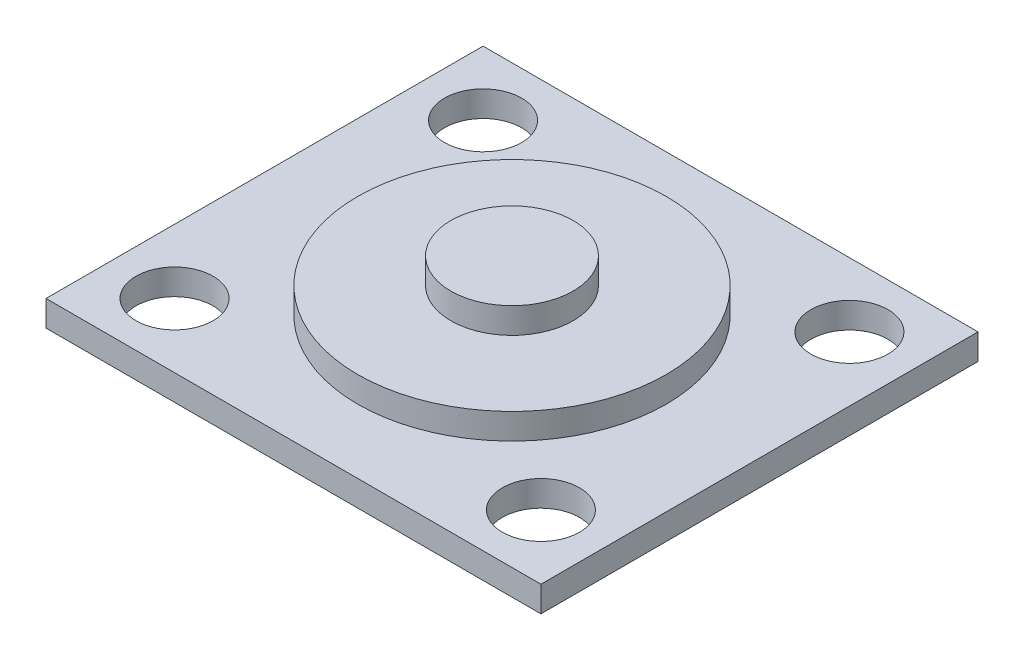
ISO-10303-21;
HEADER;
FILE_DESCRIPTION(('STEP AP214'),'2;1');
FILE_NAME('part.step','',(''),(''),'','','');
FILE_SCHEMA(('AUTOMOTIVE_DESIGN { 1 0 10303 214 1 1 1 1 }'));
ENDSEC;
DATA;
#1=APPLICATION_CONTEXT('core data for automotive mechanical design processes');
#2=APPLICATION_PROTOCOL_DEFINITION('international standard','automotive_design',2000,#1);
#3=PRODUCT_CONTEXT('',#1,'mechanical');
#4=PRODUCT('Part','Part','',(#3));
#5=PRODUCT_RELATED_PRODUCT_CATEGORY('part','',(#4));
#6=PRODUCT_DEFINITION_FORMATION('','',#4);
#7=PRODUCT_DEFINITION_CONTEXT('part definition',#1,'design');
#8=PRODUCT_DEFINITION('design','',#6,#7);
#9=PRODUCT_DEFINITION_SHAPE('','',#8);
#10=(LENGTH_UNIT() NAMED_UNIT(*) SI_UNIT(.MILLI.,.METRE.));
#11=(NAMED_UNIT(*) PLANE_ANGLE_UNIT() SI_UNIT($,.RADIAN.));
#12=(NAMED_UNIT(*) SI_UNIT($,.STERADIAN.) SOLID_ANGLE_UNIT());
#13=UNCERTAINTY_MEASURE_WITH_UNIT(LENGTH_MEASURE(1.E-05),#10,'distance_accuracy_value','');
#14=(GEOMETRIC_REPRESENTATION_CONTEXT(3) GLOBAL_UNCERTAINTY_ASSIGNED_CONTEXT((#13)) GLOBAL_UNIT_ASSIGNED_CONTEXT((#10,
#11,#12)) REPRESENTATION_CONTEXT('',''));
#15=CARTESIAN_POINT('',(0.,0.,0.));
#16=DIRECTION('',(0.,0.,1.));
#17=DIRECTION('',(1.,0.,0.));
#18=AXIS2_PLACEMENT_3D('',#15,#16,#17);
#19=CARTESIAN_POINT('',(-29.2998826313516,2.,0.));
#20=DIRECTION('',(1.,0.,0.));
#21=DIRECTION('',(0.,0.,-1.));
#22=AXIS2_PLACEMENT_3D('',#19,#20,#21);
#23=PLANE('',#22);
#24=DIRECTION('',(0.,0.,1.));
#25=VECTOR('',#24,1.);
#26=CARTESIAN_POINT('',(-29.2998826313516,0.,0.));
#27=LINE('',#26,#25);
#28=CARTESIAN_POINT('',(-29.2998826313516,0.,8.6384051626913));
#29=VERTEX_POINT('',#28);
#30=CARTESIAN_POINT('',(-29.2998826313516,0.,42.6384051626913));
#31=VERTEX_POINT('',#30);
#32=EDGE_CURVE('E114',#29,#31,#27,.T.);
#33=ORIENTED_EDGE('',*,*,#32,.T.);
#34=DIRECTION('',(0.,-1.,0.));
#35=VECTOR('',#34,1.);
#36=CARTESIAN_POINT('',(-29.2998826313516,2.,42.6384051626913));
#37=LINE('',#36,#35);
#38=CARTESIAN_POINT('',(-29.2998826313516,2.,42.6384051626913));
#39=VERTEX_POINT('',#38);
#40=EDGE_CURVE('E11',#39,#31,#37,.T.);
#41=ORIENTED_EDGE('',*,*,#40,.F.);
#42=DIRECTION('',(0.,0.,1.));
#43=VECTOR('',#42,1.);
#44=CARTESIAN_POINT('',(-29.2998826313516,2.,0.));
#45=LINE('',#44,#43);
#46=CARTESIAN_POINT('',(-29.2998826313516,2.,8.6384051626913));
#47=VERTEX_POINT('',#46);
#48=EDGE_CURVE('E86',#47,#39,#45,.T.);
#49=ORIENTED_EDGE('',*,*,#48,.F.);
#50=DIRECTION('',(0.,-1.,0.));
#51=VECTOR('',#50,1.);
#52=CARTESIAN_POINT('',(-29.2998826313516,2.,8.6384051626913));
#53=LINE('',#52,#51);
#54=EDGE_CURVE('E53',#47,#29,#53,.T.);
#55=ORIENTED_EDGE('',*,*,#54,.T.);
#56=EDGE_LOOP('',(#33,#41,#49,#55));
#57=FACE_BOUND('',#56,.T.);
#58=ADVANCED_FACE('F35',(#57),#23,.F.);
#59=CARTESIAN_POINT('',(0.,2.,42.6384051626913));
#60=DIRECTION('',(0.,0.,-1.));
#61=DIRECTION('',(-1.,0.,0.));
#62=AXIS2_PLACEMENT_3D('',#59,#60,#61);
#63=PLANE('',#62);
#64=DIRECTION('',(1.,0.,0.));
#65=VECTOR('',#64,1.);
#66=CARTESIAN_POINT('',(0.,0.,42.6384051626913));
#67=LINE('',#66,#65);
#68=CARTESIAN_POINT('',(9.20011736864843,0.,42.6384051626913));
#69=VERTEX_POINT('',#68);
#70=EDGE_CURVE('E91',#31,#69,#67,.T.);
#71=ORIENTED_EDGE('',*,*,#70,.T.);
#72=DIRECTION('',(0.,-1.,0.));
#73=VECTOR('',#72,1.);
#74=CARTESIAN_POINT('',(9.20011736864843,2.,42.6384051626913));
#75=LINE('',#74,#73);
#76=CARTESIAN_POINT('',(9.20011736864843,2.,42.6384051626913));
#77=VERTEX_POINT('',#76);
#78=EDGE_CURVE('E45',#77,#69,#75,.T.);
#79=ORIENTED_EDGE('',*,*,#78,.F.);
#80=DIRECTION('',(1.,0.,0.));
#81=VECTOR('',#80,1.);
#82=CARTESIAN_POINT('',(0.,2.,42.6384051626913));
#83=LINE('',#82,#81);
#84=EDGE_CURVE('E79',#39,#77,#83,.T.);
#85=ORIENTED_EDGE('',*,*,#84,.F.);
#86=ORIENTED_EDGE('',*,*,#40,.T.);
#87=EDGE_LOOP('',(#71,#79,#85,#86));
#88=FACE_BOUND('',#87,.T.);
#89=ADVANCED_FACE('F90',(#88),#63,.F.);
#90=CARTESIAN_POINT('',(9.20011736864842,2.,0.));
#91=DIRECTION('',(-1.,0.,0.));
#92=DIRECTION('',(0.,0.,1.));
#93=AXIS2_PLACEMENT_3D('',#90,#91,#92);
#94=PLANE('',#93);
#95=DIRECTION('',(0.,0.,-1.));
#96=VECTOR('',#95,1.);
#97=CARTESIAN_POINT('',(9.20011736864842,0.,0.));
#98=LINE('',#97,#96);
#99=CARTESIAN_POINT('',(9.20011736864842,0.,8.6384051626913));
#100=VERTEX_POINT('',#99);
#101=EDGE_CURVE('E117',#69,#100,#98,.T.);
#102=ORIENTED_EDGE('',*,*,#101,.T.);
#103=DIRECTION('',(0.,-1.,0.));
#104=VECTOR('',#103,1.);
#105=CARTESIAN_POINT('',(9.20011736864842,2.,8.6384051626913));
#106=LINE('',#105,#104);
#107=CARTESIAN_POINT('',(9.20011736864842,2.,8.6384051626913));
#108=VERTEX_POINT('',#107);
#109=EDGE_CURVE('E68',#108,#100,#106,.T.);
#110=ORIENTED_EDGE('',*,*,#109,.F.);
#111=DIRECTION('',(0.,0.,-1.));
#112=VECTOR('',#111,1.);
#113=CARTESIAN_POINT('',(9.20011736864842,2.,0.));
#114=LINE('',#113,#112);
#115=EDGE_CURVE('E85',#77,#108,#114,.T.);
#116=ORIENTED_EDGE('',*,*,#115,.F.);
#117=ORIENTED_EDGE('',*,*,#78,.T.);
#118=EDGE_LOOP('',(#102,#110,#116,#117));
#119=FACE_BOUND('',#118,.T.);
#120=ADVANCED_FACE('F95',(#119),#94,.F.);
#121=CARTESIAN_POINT('',(-24.2998826313516,2.,37.6384051626913));
#122=DIRECTION('',(0.,-1.,0.));
#123=DIRECTION('',(0.,0.,-1.));
#124=AXIS2_PLACEMENT_3D('',#121,#122,#123);
#125=CYLINDRICAL_SURFACE('',#124,3.);
#126=CARTESIAN_POINT('',(-24.2998826313516,2.,37.6384051626913));
#127=DIRECTION('',(0.,1.,0.));
#128=DIRECTION('',(0.,0.,1.));
#129=AXIS2_PLACEMENT_3D('',#126,#127,#128);
#130=CIRCLE('',#129,3.);
#131=CARTESIAN_POINT('',(-24.2998826313516,2.,40.6384051626913));
#132=VERTEX_POINT('',#131);
#133=EDGE_CURVE('E138',#132,#132,#130,.T.);
#134=ORIENTED_EDGE('',*,*,#133,.T.);
#135=EDGE_LOOP('',(#134));
#136=FACE_BOUND('',#135,.T.);
#137=CARTESIAN_POINT('',(-24.2998826313516,0.,37.6384051626913));
#138=DIRECTION('',(0.,1.,0.));
#139=DIRECTION('',(0.,0.,1.));
#140=AXIS2_PLACEMENT_3D('',#137,#138,#139);
#141=CIRCLE('',#140,3.);
#142=CARTESIAN_POINT('',(-24.2998826313516,0.,40.6384051626913));
#143=VERTEX_POINT('',#142);
#144=EDGE_CURVE('E111',#143,#143,#141,.T.);
#145=ORIENTED_EDGE('',*,*,#144,.F.);
#146=EDGE_LOOP('',(#145));
#147=FACE_BOUND('',#146,.T.);
#148=ADVANCED_FACE('F142',(#136,#147),#125,.F.);
#149=CARTESIAN_POINT('',(4.20011736864842,2.,37.6384051626913));
#150=DIRECTION('',(0.,-1.,0.));
#151=DIRECTION('',(0.,0.,-1.));
#152=AXIS2_PLACEMENT_3D('',#149,#150,#151);
#153=CYLINDRICAL_SURFACE('',#152,3.);
#154=CARTESIAN_POINT('',(4.20011736864842,2.,37.6384051626913));
#155=DIRECTION('',(0.,1.,0.));
#156=DIRECTION('',(0.,0.,1.));
#157=AXIS2_PLACEMENT_3D('',#154,#155,#156);
#158=CIRCLE('',#157,3.);
#159=CARTESIAN_POINT('',(4.20011736864842,2.,40.6384051626913));
#160=VERTEX_POINT('',#159);
#161=EDGE_CURVE('E131',#160,#160,#158,.T.);
#162=ORIENTED_EDGE('',*,*,#161,.T.);
#163=EDGE_LOOP('',(#162));
#164=FACE_BOUND('',#163,.T.);
#165=CARTESIAN_POINT('',(4.20011736864842,0.,37.6384051626913));
#166=DIRECTION('',(0.,1.,0.));
#167=DIRECTION('',(0.,0.,1.));
#168=AXIS2_PLACEMENT_3D('',#165,#166,#167);
#169=CIRCLE('',#168,3.);
#170=CARTESIAN_POINT('',(4.20011736864842,0.,40.6384051626913));
#171=VERTEX_POINT('',#170);
#172=EDGE_CURVE('E108',#171,#171,#169,.T.);
#173=ORIENTED_EDGE('',*,*,#172,.F.);
#174=EDGE_LOOP('',(#173));
#175=FACE_BOUND('',#174,.T.);
#176=ADVANCED_FACE('F171',(#164,#175),#153,.F.);
#177=CARTESIAN_POINT('',(4.20011736864842,2.,13.6384051626913));
#178=DIRECTION('',(0.,-1.,0.));
#179=DIRECTION('',(0.,0.,-1.));
#180=AXIS2_PLACEMENT_3D('',#177,#178,#179);
#181=CYLINDRICAL_SURFACE('',#180,3.);
#182=CARTESIAN_POINT('',(4.20011736864842,2.,13.6384051626913));
#183=DIRECTION('',(0.,1.,0.));
#184=DIRECTION('',(0.,0.,1.));
#185=AXIS2_PLACEMENT_3D('',#182,#183,#184);
#186=CIRCLE('',#185,3.);
#187=CARTESIAN_POINT('',(4.20011736864842,2.,16.6384051626913));
#188=VERTEX_POINT('',#187);
#189=EDGE_CURVE('E126',#188,#188,#186,.T.);
#190=ORIENTED_EDGE('',*,*,#189,.T.);
#191=EDGE_LOOP('',(#190));
#192=FACE_BOUND('',#191,.T.);
#193=CARTESIAN_POINT('',(4.20011736864842,0.,13.6384051626913));
#194=DIRECTION('',(0.,1.,0.));
#195=DIRECTION('',(0.,0.,1.));
#196=AXIS2_PLACEMENT_3D('',#193,#194,#195);
#197=CIRCLE('',#196,3.);
#198=CARTESIAN_POINT('',(4.20011736864842,0.,16.6384051626913));
#199=VERTEX_POINT('',#198);
#200=EDGE_CURVE('E104',#199,#199,#197,.T.);
#201=ORIENTED_EDGE('',*,*,#200,.F.);
#202=EDGE_LOOP('',(#201));
#203=FACE_BOUND('',#202,.T.);
#204=ADVANCED_FACE('F173',(#192,#203),#181,.F.);
#205=CARTESIAN_POINT('',(-24.2998826313516,2.,13.6384051626913));
#206=DIRECTION('',(0.,-1.,0.));
#207=DIRECTION('',(0.,0.,-1.));
#208=AXIS2_PLACEMENT_3D('',#205,#206,#207);
#209=CYLINDRICAL_SURFACE('',#208,3.);
#210=CARTESIAN_POINT('',(-24.2998826313516,2.,13.6384051626913));
#211=DIRECTION('',(0.,1.,0.));
#212=DIRECTION('',(0.,0.,1.));
#213=AXIS2_PLACEMENT_3D('',#210,#211,#212);
#214=CIRCLE('',#213,3.);
#215=CARTESIAN_POINT('',(-24.2998826313516,2.,16.6384051626913));
#216=VERTEX_POINT('',#215);
#217=EDGE_CURVE('E122',#216,#216,#214,.T.);
#218=ORIENTED_EDGE('',*,*,#217,.T.);
#219=EDGE_LOOP('',(#218));
#220=FACE_BOUND('',#219,.T.);
#221=CARTESIAN_POINT('',(-24.2998826313516,0.,13.6384051626913));
#222=DIRECTION('',(0.,1.,0.));
#223=DIRECTION('',(0.,0.,1.));
#224=AXIS2_PLACEMENT_3D('',#221,#222,#223);
#225=CIRCLE('',#224,3.);
#226=CARTESIAN_POINT('',(-24.2998826313516,0.,16.6384051626913));
#227=VERTEX_POINT('',#226);
#228=EDGE_CURVE('E101',#227,#227,#225,.T.);
#229=ORIENTED_EDGE('',*,*,#228,.F.);
#230=EDGE_LOOP('',(#229));
#231=FACE_BOUND('',#230,.T.);
#232=ADVANCED_FACE('F37',(#220,#231),#209,.F.);
#233=CARTESIAN_POINT('',(0.,2.,8.6384051626913));
#234=DIRECTION('',(0.,0.,-1.));
#235=DIRECTION('',(-1.,0.,0.));
#236=AXIS2_PLACEMENT_3D('',#233,#234,#235);
#237=PLANE('',#236);
#238=DIRECTION('',(1.,0.,0.));
#239=VECTOR('',#238,1.);
#240=CARTESIAN_POINT('',(0.,0.,8.6384051626913));
#241=LINE('',#240,#239);
#242=EDGE_CURVE('E119',#29,#100,#241,.T.);
#243=ORIENTED_EDGE('',*,*,#242,.F.);
#244=ORIENTED_EDGE('',*,*,#54,.F.);
#245=DIRECTION('',(1.,0.,0.));
#246=VECTOR('',#245,1.);
#247=CARTESIAN_POINT('',(0.,2.,8.6384051626913));
#248=LINE('',#247,#246);
#249=EDGE_CURVE('E96',#47,#108,#248,.T.);
#250=ORIENTED_EDGE('',*,*,#249,.T.);
#251=ORIENTED_EDGE('',*,*,#109,.T.);
#252=EDGE_LOOP('',(#243,#244,#250,#251));
#253=FACE_BOUND('',#252,.T.);
#254=ADVANCED_FACE('F147',(#253),#237,.T.);
#255=CARTESIAN_POINT('',(0.,2.,0.));
#256=DIRECTION('',(0.,1.,0.));
#257=DIRECTION('',(0.,0.,1.));
#258=AXIS2_PLACEMENT_3D('',#255,#256,#257);
#259=PLANE('',#258);
#260=CARTESIAN_POINT('',(-10.0498826313516,2.,25.6384051626913));
#261=DIRECTION('',(0.,1.,0.));
#262=DIRECTION('',(0.,0.,1.));
#263=AXIS2_PLACEMENT_3D('',#260,#261,#262);
#264=CIRCLE('',#263,12.);
#265=CARTESIAN_POINT('',(-10.0498826313516,2.,37.6384051626913));
#266=VERTEX_POINT('',#265);
#267=EDGE_CURVE('E105',#266,#266,#264,.F.);
#268=ORIENTED_EDGE('',*,*,#267,.T.);
#269=EDGE_LOOP('',(#268));
#270=FACE_BOUND('',#269,.T.);
#271=ORIENTED_EDGE('',*,*,#217,.F.);
#272=EDGE_LOOP('',(#271));
#273=FACE_BOUND('',#272,.T.);
#274=ORIENTED_EDGE('',*,*,#189,.F.);
#275=EDGE_LOOP('',(#274));
#276=FACE_BOUND('',#275,.T.);
#277=ORIENTED_EDGE('',*,*,#161,.F.);
#278=EDGE_LOOP('',(#277));
#279=FACE_BOUND('',#278,.T.);
#280=ORIENTED_EDGE('',*,*,#133,.F.);
#281=EDGE_LOOP('',(#280));
#282=FACE_BOUND('',#281,.T.);
#283=ORIENTED_EDGE('',*,*,#48,.T.);
#284=ORIENTED_EDGE('',*,*,#84,.T.);
#285=ORIENTED_EDGE('',*,*,#115,.T.);
#286=ORIENTED_EDGE('',*,*,#249,.F.);
#287=EDGE_LOOP('',(#283,#284,#285,#286));
#288=FACE_BOUND('',#287,.T.);
#289=ADVANCED_FACE('F82',(#270,#273,#276,#279,#282,#288),#259,.T.);
#290=CARTESIAN_POINT('',(0.,0.,0.));
#291=DIRECTION('',(0.,1.,0.));
#292=DIRECTION('',(0.,0.,1.));
#293=AXIS2_PLACEMENT_3D('',#290,#291,#292);
#294=PLANE('',#293);
#295=ORIENTED_EDGE('',*,*,#228,.T.);
#296=EDGE_LOOP('',(#295));
#297=FACE_BOUND('',#296,.T.);
#298=ORIENTED_EDGE('',*,*,#200,.T.);
#299=EDGE_LOOP('',(#298));
#300=FACE_BOUND('',#299,.T.);
#301=ORIENTED_EDGE('',*,*,#172,.T.);
#302=EDGE_LOOP('',(#301));
#303=FACE_BOUND('',#302,.T.);
#304=ORIENTED_EDGE('',*,*,#144,.T.);
#305=EDGE_LOOP('',(#304));
#306=FACE_BOUND('',#305,.T.);
#307=ORIENTED_EDGE('',*,*,#32,.F.);
#308=ORIENTED_EDGE('',*,*,#242,.T.);
#309=ORIENTED_EDGE('',*,*,#101,.F.);
#310=ORIENTED_EDGE('',*,*,#70,.F.);
#311=EDGE_LOOP('',(#307,#308,#309,#310));
#312=FACE_BOUND('',#311,.T.);
#313=ADVANCED_FACE('F146',(#297,#300,#303,#306,#312),#294,.F.);
#314=CARTESIAN_POINT('',(-10.0498826313516,4.,25.6384051626913));
#315=DIRECTION('',(0.,-1.,0.));
#316=DIRECTION('',(0.,0.,-1.));
#317=AXIS2_PLACEMENT_3D('',#314,#315,#316);
#318=CYLINDRICAL_SURFACE('',#317,12.);
#319=ORIENTED_EDGE('',*,*,#267,.F.);
#320=EDGE_LOOP('',(#319));
#321=FACE_BOUND('',#320,.T.);
#322=CARTESIAN_POINT('',(-10.0498826313516,4.,25.6384051626913));
#323=DIRECTION('',(0.,1.,0.));
#324=DIRECTION('',(0.,0.,1.));
#325=AXIS2_PLACEMENT_3D('',#322,#323,#324);
#326=CIRCLE('',#325,12.);
#327=CARTESIAN_POINT('',(-10.0498826313516,4.,37.6384051626913));
#328=VERTEX_POINT('',#327);
#329=EDGE_CURVE('E258',#328,#328,#326,.T.);
#330=ORIENTED_EDGE('',*,*,#329,.F.);
#331=EDGE_LOOP('',(#330));
#332=FACE_BOUND('',#331,.T.);
#333=ADVANCED_FACE('F154',(#321,#332),#318,.T.);
#334=CARTESIAN_POINT('',(-10.0498826313516,4.,25.6384051626913));
#335=DIRECTION('',(0.,1.,0.));
#336=DIRECTION('',(0.,0.,1.));
#337=AXIS2_PLACEMENT_3D('',#334,#335,#336);
#338=PLANE('',#337);
#339=CARTESIAN_POINT('',(-10.0498826313516,4.,25.6384051626913));
#340=DIRECTION('',(0.,1.,0.));
#341=DIRECTION('',(0.,0.,1.));
#342=AXIS2_PLACEMENT_3D('',#339,#340,#341);
#343=CIRCLE('',#342,4.75805685076094);
#344=CARTESIAN_POINT('',(-10.0498826313516,4.,30.3964620134523));
#345=VERTEX_POINT('',#344);
#346=EDGE_CURVE('E39',#345,#345,#343,.F.);
#347=ORIENTED_EDGE('',*,*,#346,.T.);
#348=EDGE_LOOP('',(#347));
#349=FACE_BOUND('',#348,.T.);
#350=ORIENTED_EDGE('',*,*,#329,.T.);
#351=EDGE_LOOP('',(#350));
#352=FACE_BOUND('',#351,.T.);
#353=ADVANCED_FACE('F214',(#349,#352),#338,.T.);
#354=CARTESIAN_POINT('',(-10.0498826313516,6.,25.6384051626913));
#355=DIRECTION('',(0.,-1.,0.));
#356=DIRECTION('',(0.,0.,-1.));
#357=AXIS2_PLACEMENT_3D('',#354,#355,#356);
#358=CYLINDRICAL_SURFACE('',#357,4.75805685076094);
#359=ORIENTED_EDGE('',*,*,#346,.F.);
#360=EDGE_LOOP('',(#359));
#361=FACE_BOUND('',#360,.T.);
#362=CARTESIAN_POINT('',(-10.0498826313516,6.,25.6384051626913));
#363=DIRECTION('',(0.,1.,0.));
#364=DIRECTION('',(0.,0.,1.));
#365=AXIS2_PLACEMENT_3D('',#362,#363,#364);
#366=CIRCLE('',#365,4.75805685076094);
#367=CARTESIAN_POINT('',(-10.0498826313516,6.,30.3964620134523));
#368=VERTEX_POINT('',#367);
#369=EDGE_CURVE('E254',#368,#368,#366,.T.);
#370=ORIENTED_EDGE('',*,*,#369,.F.);
#371=EDGE_LOOP('',(#370));
#372=FACE_BOUND('',#371,.T.);
#373=ADVANCED_FACE('F228',(#361,#372),#358,.T.);
#374=CARTESIAN_POINT('',(-10.0498826313516,6.,25.6384051626913));
#375=DIRECTION('',(0.,1.,0.));
#376=DIRECTION('',(0.,0.,1.));
#377=AXIS2_PLACEMENT_3D('',#374,#375,#376);
#378=PLANE('',#377);
#379=ORIENTED_EDGE('',*,*,#369,.T.);
#380=EDGE_LOOP('',(#379));
#381=FACE_BOUND('',#380,.T.);
#382=ADVANCED_FACE('F238',(#381),#378,.T.);
#383=CLOSED_SHELL('',(#58,#89,#120,#148,#176,#204,#232,#254,#289,#313,#333,#353,#373,#382));
#384=MANIFOLD_SOLID_BREP('B2',#383);
#385=ADVANCED_BREP_SHAPE_REPRESENTATION('',(#18,#384),#14);
#386=SHAPE_DEFINITION_REPRESENTATION(#9,#385);
ENDSEC;
END-ISO-10303-21;
